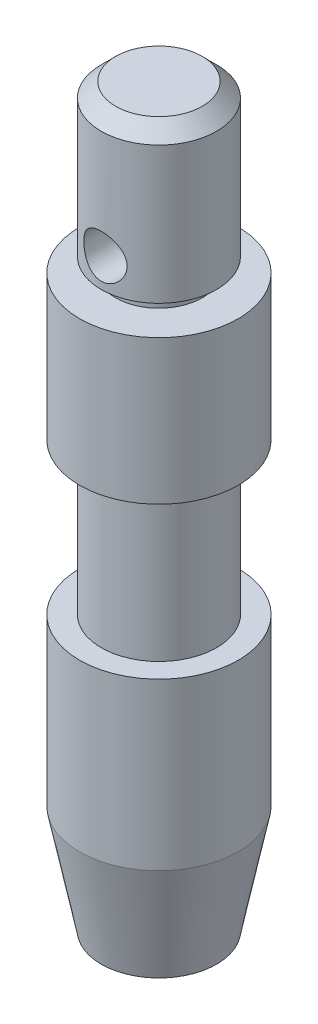
ISO-10303-21;
HEADER;
FILE_DESCRIPTION(('STEP AP214'),'2;1');
FILE_NAME('part.step','',(''),(''),'','','');
FILE_SCHEMA(('AUTOMOTIVE_DESIGN { 1 0 10303 214 1 1 1 1 }'));
ENDSEC;
DATA;
#1=APPLICATION_CONTEXT('core data for automotive mechanical design processes');
#2=APPLICATION_PROTOCOL_DEFINITION('international standard','automotive_design',2000,#1);
#3=PRODUCT_CONTEXT('',#1,'mechanical');
#4=PRODUCT('Part','Part','',(#3));
#5=PRODUCT_RELATED_PRODUCT_CATEGORY('part','',(#4));
#6=PRODUCT_DEFINITION_FORMATION('','',#4);
#7=PRODUCT_DEFINITION_CONTEXT('part definition',#1,'design');
#8=PRODUCT_DEFINITION('design','',#6,#7);
#9=PRODUCT_DEFINITION_SHAPE('','',#8);
#10=(LENGTH_UNIT() NAMED_UNIT(*) SI_UNIT(.MILLI.,.METRE.));
#11=(NAMED_UNIT(*) PLANE_ANGLE_UNIT() SI_UNIT($,.RADIAN.));
#12=(NAMED_UNIT(*) SI_UNIT($,.STERADIAN.) SOLID_ANGLE_UNIT());
#13=UNCERTAINTY_MEASURE_WITH_UNIT(LENGTH_MEASURE(1.E-05),#10,'distance_accuracy_value','');
#14=(GEOMETRIC_REPRESENTATION_CONTEXT(3) GLOBAL_UNCERTAINTY_ASSIGNED_CONTEXT((#13)) GLOBAL_UNIT_ASSIGNED_CONTEXT((#10,
#11,#12)) REPRESENTATION_CONTEXT('',''));
#15=CARTESIAN_POINT('',(0.,0.,0.));
#16=DIRECTION('',(0.,0.,1.));
#17=DIRECTION('',(1.,0.,0.));
#18=AXIS2_PLACEMENT_3D('',#15,#16,#17);
#19=CARTESIAN_POINT('',(0.,19.,0.));
#20=DIRECTION('',(0.,-1.,0.));
#21=DIRECTION('',(0.,0.,-1.));
#22=AXIS2_PLACEMENT_3D('',#19,#20,#21);
#23=CYLINDRICAL_SURFACE('',#22,5.5);
#24=CARTESIAN_POINT('',(0.,7.50000000000015,0.));
#25=DIRECTION('',(0.,1.,0.));
#26=DIRECTION('',(0.,0.,1.));
#27=AXIS2_PLACEMENT_3D('',#24,#25,#26);
#28=CIRCLE('',#27,5.5);
#29=CARTESIAN_POINT('',(0.,7.50000000000015,5.5));
#30=VERTEX_POINT('',#29);
#31=EDGE_CURVE('E133',#30,#30,#28,.T.);
#32=ORIENTED_EDGE('',*,*,#31,.T.);
#33=EDGE_LOOP('',(#32));
#34=FACE_BOUND('',#33,.T.);
#35=CARTESIAN_POINT('',(0.,19.,0.));
#36=DIRECTION('',(0.,1.,0.));
#37=DIRECTION('',(0.,0.,1.));
#38=AXIS2_PLACEMENT_3D('',#35,#36,#37);
#39=CIRCLE('',#38,5.5);
#40=CARTESIAN_POINT('',(0.,19.,5.5));
#41=VERTEX_POINT('',#40);
#42=EDGE_CURVE('E135',#41,#41,#39,.T.);
#43=ORIENTED_EDGE('',*,*,#42,.F.);
#44=EDGE_LOOP('',(#43));
#45=FACE_BOUND('',#44,.T.);
#46=ADVANCED_FACE('F47',(#34,#45),#23,.T.);
#47=CARTESIAN_POINT('',(0.,19.,0.));
#48=DIRECTION('',(0.,1.,0.));
#49=DIRECTION('',(0.,0.,1.));
#50=AXIS2_PLACEMENT_3D('',#47,#48,#49);
#51=PLANE('',#50);
#52=CARTESIAN_POINT('',(0.,19.,0.));
#53=DIRECTION('',(0.,1.,0.));
#54=DIRECTION('',(0.,0.,1.));
#55=AXIS2_PLACEMENT_3D('',#52,#53,#54);
#56=CIRCLE('',#55,4.);
#57=CARTESIAN_POINT('',(0.,19.,-4.));
#58=VERTEX_POINT('',#57);
#59=EDGE_CURVE('E139',#58,#58,#56,.T.);
#60=ORIENTED_EDGE('',*,*,#59,.F.);
#61=EDGE_LOOP('',(#60));
#62=FACE_BOUND('',#61,.T.);
#63=ORIENTED_EDGE('',*,*,#42,.T.);
#64=EDGE_LOOP('',(#63));
#65=FACE_BOUND('',#64,.T.);
#66=ADVANCED_FACE('F101',(#62,#65),#51,.T.);
#67=CARTESIAN_POINT('',(0.,0.,0.));
#68=DIRECTION('',(0.,1.,0.));
#69=DIRECTION('',(0.,0.,1.));
#70=AXIS2_PLACEMENT_3D('',#67,#68,#69);
#71=PLANE('',#70);
#72=CARTESIAN_POINT('',(0.,0.,0.));
#73=DIRECTION('',(0.,1.,0.));
#74=DIRECTION('',(0.,0.,1.));
#75=AXIS2_PLACEMENT_3D('',#72,#73,#74);
#76=CIRCLE('',#75,3.99999999999999);
#77=CARTESIAN_POINT('',(0.,0.,3.99999999999999));
#78=VERTEX_POINT('',#77);
#79=EDGE_CURVE('E131',#78,#78,#76,.F.);
#80=ORIENTED_EDGE('',*,*,#79,.T.);
#81=EDGE_LOOP('',(#80));
#82=FACE_BOUND('',#81,.T.);
#83=ADVANCED_FACE('F108',(#82),#71,.F.);
#84=CARTESIAN_POINT('',(0.,7.50000000000015,0.));
#85=DIRECTION('',(0.,1.,0.));
#86=DIRECTION('',(0.,0.,1.));
#87=AXIS2_PLACEMENT_3D('',#84,#85,#86);
#88=CONICAL_SURFACE('',#87,5.5,0.197395559849877);
#89=CARTESIAN_POINT('',(0.,0.,3.99999999999999));
#90=CARTESIAN_POINT('',(0.,0.0781250000000007,4.01562499999999));
#91=CARTESIAN_POINT('',(0.,0.156250000000002,4.03124999999999));
#92=CARTESIAN_POINT('',(0.,0.312500000000005,4.06249999999999));
#93=CARTESIAN_POINT('',(0.,0.390625000000007,4.07812499999999));
#94=CARTESIAN_POINT('',(0.,0.546875000000011,4.10937499999999));
#95=CARTESIAN_POINT('',(0.,0.625000000000012,4.12499999999999));
#96=CARTESIAN_POINT('',(0.,0.781250000000015,4.15624999999999));
#97=CARTESIAN_POINT('',(0.,0.859375000000017,4.17187499999999));
#98=CARTESIAN_POINT('',(0.,1.01562500000002,4.20312499999999));
#99=CARTESIAN_POINT('',(0.,1.09375000000002,4.21874999999999));
#100=CARTESIAN_POINT('',(0.,1.25000000000002,4.24999999999999));
#101=CARTESIAN_POINT('',(0.,1.32812500000003,4.26562499999999));
#102=CARTESIAN_POINT('',(0.,1.48437500000003,4.296875));
#103=CARTESIAN_POINT('',(0.,1.56250000000003,4.3125));
#104=CARTESIAN_POINT('',(0.,1.71875000000003,4.34375));
#105=CARTESIAN_POINT('',(0.,1.79687500000004,4.359375));
#106=CARTESIAN_POINT('',(0.,1.95312500000004,4.390625));
#107=CARTESIAN_POINT('',(0.,2.03125000000004,4.40625));
#108=CARTESIAN_POINT('',(0.,2.18750000000004,4.4375));
#109=CARTESIAN_POINT('',(0.,2.26562500000005,4.453125));
#110=CARTESIAN_POINT('',(0.,2.42187500000005,4.484375));
#111=CARTESIAN_POINT('',(0.,2.50000000000005,4.5));
#112=CARTESIAN_POINT('',(0.,2.65625000000005,4.53125));
#113=CARTESIAN_POINT('',(0.,2.73437500000006,4.546875));
#114=CARTESIAN_POINT('',(0.,2.89062500000006,4.578125));
#115=CARTESIAN_POINT('',(0.,2.96875000000006,4.59375));
#116=CARTESIAN_POINT('',(0.,3.12500000000006,4.625));
#117=CARTESIAN_POINT('',(0.,3.20312500000006,4.640625));
#118=CARTESIAN_POINT('',(0.,3.35937500000007,4.671875));
#119=CARTESIAN_POINT('',(0.,3.43750000000007,4.6875));
#120=CARTESIAN_POINT('',(0.,3.59375000000007,4.71875));
#121=CARTESIAN_POINT('',(0.,3.67187500000007,4.734375));
#122=CARTESIAN_POINT('',(0.,3.82812500000008,4.765625));
#123=CARTESIAN_POINT('',(0.,3.90625000000008,4.78125));
#124=CARTESIAN_POINT('',(0.,4.06250000000008,4.8125));
#125=CARTESIAN_POINT('',(0.,4.14062500000008,4.828125));
#126=CARTESIAN_POINT('',(0.,4.29687500000009,4.859375));
#127=CARTESIAN_POINT('',(0.,4.37500000000009,4.875));
#128=CARTESIAN_POINT('',(0.,4.53125000000009,4.90625));
#129=CARTESIAN_POINT('',(0.,4.60937500000009,4.921875));
#130=CARTESIAN_POINT('',(0.,4.7656250000001,4.953125));
#131=CARTESIAN_POINT('',(0.,4.8437500000001,4.96875));
#132=CARTESIAN_POINT('',(0.,5.0000000000001,5.));
#133=CARTESIAN_POINT('',(0.,5.0781250000001,5.015625));
#134=CARTESIAN_POINT('',(0.,5.23437500000011,5.046875));
#135=CARTESIAN_POINT('',(0.,5.31250000000011,5.0625));
#136=CARTESIAN_POINT('',(0.,5.46875000000011,5.09375));
#137=CARTESIAN_POINT('',(0.,5.54687500000011,5.109375));
#138=CARTESIAN_POINT('',(0.,5.70312500000012,5.140625));
#139=CARTESIAN_POINT('',(0.,5.78125000000012,5.15625));
#140=CARTESIAN_POINT('',(0.,5.93750000000012,5.1875));
#141=CARTESIAN_POINT('',(0.,6.01562500000012,5.203125));
#142=CARTESIAN_POINT('',(0.,6.17187500000012,5.234375));
#143=CARTESIAN_POINT('',(0.,6.25000000000013,5.25));
#144=CARTESIAN_POINT('',(0.,6.40625000000013,5.28125));
#145=CARTESIAN_POINT('',(0.,6.48437500000013,5.296875));
#146=CARTESIAN_POINT('',(0.,6.64062500000013,5.328125));
#147=CARTESIAN_POINT('',(0.,6.71875000000014,5.34375));
#148=CARTESIAN_POINT('',(0.,6.87500000000014,5.375));
#149=CARTESIAN_POINT('',(0.,6.95312500000014,5.390625));
#150=CARTESIAN_POINT('',(0.,7.10937500000014,5.421875));
#151=CARTESIAN_POINT('',(0.,7.18750000000014,5.4375));
#152=CARTESIAN_POINT('',(0.,7.34375000000015,5.46875));
#153=CARTESIAN_POINT('',(0.,7.42187500000015,5.484375));
#154=CARTESIAN_POINT('',(0.,7.50000000000015,5.5));
#155=B_SPLINE_CURVE_WITH_KNOTS('',3,(#89,#90,#91,#92,#93,#94,#95,#96,#97,#98,#99,#100,#101,#102,
#103,#104,#105,#106,#107,#108,#109,#110,#111,#112,#113,#114,#115,#116,#117,#118,#119,#120,#121,
#122,#123,#124,#125,#126,#127,#128,#129,#130,#131,#132,#133,#134,#135,#136,#137,#138,#139,#140,
#141,#142,#143,#144,#145,#146,#147,#148,#149,#150,#151,#152,#153,#154),.UNSPECIFIED.,.F.,.F.,(4,
2,2,2,2,2,2,2,2,2,2,2,2,2,2,2,2,2,2,2,2,2,2,2,2,2,2,2,2,2,2,2,4),(0.,0.239016539699666,
0.478033079399333,0.717049619099,0.956066158798666,1.19508269849833,1.434099238198,
1.67311577789767,1.91213231759733,2.151148857297,2.39016539699667,2.62918193669633,
2.868198476396,3.10721501609566,3.34623155579533,3.585248095495,3.82426463519466,
4.06328117489433,4.302297714594,4.54131425429366,4.78033079399333,5.019347333693,
5.25836387339266,5.49738041309233,5.73639695279199,5.97541349249166,6.21443003219133,
6.45344657189099,6.69246311159066,6.93147965129033,7.17049619098999,7.40951273068966,
7.64852927038933),.UNSPECIFIED.);
#156=EDGE_CURVE('BSEAM115',#78,#30,#155,.T.);
#157=ORIENTED_EDGE('',*,*,#79,.F.);
#158=ORIENTED_EDGE('',*,*,#31,.F.);
#159=ORIENTED_EDGE('',*,*,#156,.T.);
#160=ORIENTED_EDGE('',*,*,#156,.F.);
#161=EDGE_LOOP('',(#157,#159,#158,#160));
#162=FACE_BOUND('',#161,.T.);
#163=ADVANCED_FACE('F115',(#162),#88,.T.);
#164=CARTESIAN_POINT('',(0.,29.5,0.));
#165=DIRECTION('',(0.,-1.,0.));
#166=DIRECTION('',(0.,0.,-1.));
#167=AXIS2_PLACEMENT_3D('',#164,#165,#166);
#168=CYLINDRICAL_SURFACE('',#167,4.);
#169=CARTESIAN_POINT('',(0.,29.5,0.));
#170=DIRECTION('',(0.,1.,0.));
#171=DIRECTION('',(0.,0.,1.));
#172=AXIS2_PLACEMENT_3D('',#169,#170,#171);
#173=CIRCLE('',#172,4.);
#174=CARTESIAN_POINT('',(0.,29.5,-4.));
#175=VERTEX_POINT('',#174);
#176=EDGE_CURVE('E141',#175,#175,#173,.T.);
#177=CARTESIAN_POINT('',(0.,29.5,-4.));
#178=CARTESIAN_POINT('',(0.,29.390625,-4.));
#179=CARTESIAN_POINT('',(0.,29.28125,-4.));
#180=CARTESIAN_POINT('',(0.,29.0625,-4.));
#181=CARTESIAN_POINT('',(0.,28.953125,-4.));
#182=CARTESIAN_POINT('',(0.,28.734375,-4.));
#183=CARTESIAN_POINT('',(0.,28.625,-4.));
#184=CARTESIAN_POINT('',(0.,28.40625,-4.));
#185=CARTESIAN_POINT('',(0.,28.296875,-4.));
#186=CARTESIAN_POINT('',(0.,28.078125,-4.));
#187=CARTESIAN_POINT('',(0.,27.96875,-4.));
#188=CARTESIAN_POINT('',(0.,27.75,-4.));
#189=CARTESIAN_POINT('',(0.,27.640625,-4.));
#190=CARTESIAN_POINT('',(0.,27.421875,-4.));
#191=CARTESIAN_POINT('',(0.,27.3125,-4.));
#192=CARTESIAN_POINT('',(0.,27.09375,-4.));
#193=CARTESIAN_POINT('',(0.,26.984375,-4.));
#194=CARTESIAN_POINT('',(0.,26.765625,-4.));
#195=CARTESIAN_POINT('',(0.,26.65625,-4.));
#196=CARTESIAN_POINT('',(0.,26.4375,-4.));
#197=CARTESIAN_POINT('',(0.,26.328125,-4.));
#198=CARTESIAN_POINT('',(0.,26.109375,-4.));
#199=CARTESIAN_POINT('',(0.,26.,-4.));
#200=CARTESIAN_POINT('',(0.,25.78125,-4.));
#201=CARTESIAN_POINT('',(0.,25.671875,-4.));
#202=CARTESIAN_POINT('',(0.,25.453125,-4.));
#203=CARTESIAN_POINT('',(0.,25.34375,-4.));
#204=CARTESIAN_POINT('',(0.,25.125,-4.));
#205=CARTESIAN_POINT('',(0.,25.015625,-4.));
#206=CARTESIAN_POINT('',(0.,24.796875,-4.));
#207=CARTESIAN_POINT('',(0.,24.6875,-4.));
#208=CARTESIAN_POINT('',(0.,24.46875,-4.));
#209=CARTESIAN_POINT('',(0.,24.359375,-4.));
#210=CARTESIAN_POINT('',(0.,24.140625,-4.));
#211=CARTESIAN_POINT('',(0.,24.03125,-4.));
#212=CARTESIAN_POINT('',(0.,23.8125,-4.));
#213=CARTESIAN_POINT('',(0.,23.703125,-4.));
#214=CARTESIAN_POINT('',(0.,23.484375,-4.));
#215=CARTESIAN_POINT('',(0.,23.375,-4.));
#216=CARTESIAN_POINT('',(0.,23.15625,-4.));
#217=CARTESIAN_POINT('',(0.,23.046875,-4.));
#218=CARTESIAN_POINT('',(0.,22.828125,-4.));
#219=CARTESIAN_POINT('',(0.,22.71875,-4.));
#220=CARTESIAN_POINT('',(0.,22.5,-4.));
#221=CARTESIAN_POINT('',(0.,22.390625,-4.));
#222=CARTESIAN_POINT('',(0.,22.171875,-4.));
#223=CARTESIAN_POINT('',(0.,22.0625,-4.));
#224=CARTESIAN_POINT('',(0.,21.84375,-4.));
#225=CARTESIAN_POINT('',(0.,21.734375,-4.));
#226=CARTESIAN_POINT('',(0.,21.515625,-4.));
#227=CARTESIAN_POINT('',(0.,21.40625,-4.));
#228=CARTESIAN_POINT('',(0.,21.1875,-4.));
#229=CARTESIAN_POINT('',(0.,21.078125,-4.));
#230=CARTESIAN_POINT('',(0.,20.859375,-4.));
#231=CARTESIAN_POINT('',(0.,20.75,-4.));
#232=CARTESIAN_POINT('',(0.,20.53125,-4.));
#233=CARTESIAN_POINT('',(0.,20.421875,-4.));
#234=CARTESIAN_POINT('',(0.,20.203125,-4.));
#235=CARTESIAN_POINT('',(0.,20.09375,-4.));
#236=CARTESIAN_POINT('',(0.,19.875,-4.));
#237=CARTESIAN_POINT('',(0.,19.765625,-4.));
#238=CARTESIAN_POINT('',(0.,19.546875,-4.));
#239=CARTESIAN_POINT('',(0.,19.4375,-4.));
#240=CARTESIAN_POINT('',(0.,19.21875,-4.));
#241=CARTESIAN_POINT('',(0.,19.109375,-4.));
#242=CARTESIAN_POINT('',(0.,19.,-4.));
#243=B_SPLINE_CURVE_WITH_KNOTS('',3,(#177,#178,#179,#180,#181,#182,#183,#184,#185,#186,#187,
#188,#189,#190,#191,#192,#193,#194,#195,#196,#197,#198,#199,#200,#201,#202,#203,#204,#205,#206,
#207,#208,#209,#210,#211,#212,#213,#214,#215,#216,#217,#218,#219,#220,#221,#222,#223,#224,#225,
#226,#227,#228,#229,#230,#231,#232,#233,#234,#235,#236,#237,#238,#239,#240,#241,#242),
.UNSPECIFIED.,.F.,.F.,(4,2,2,2,2,2,2,2,2,2,2,2,2,2,2,2,2,2,2,2,2,2,2,2,2,2,2,2,2,2,2,2,4),(0.,
0.328124999999999,0.656249999999997,0.984374999999999,1.3125,1.640625,1.96875,2.296875,2.625,
2.953125,3.28125,3.609375,3.9375,4.265625,4.59375,4.921875,5.25,5.578125,5.90625,6.234375,
6.5625,6.890625,7.21875,7.546875,7.875,8.20312499999999,8.53125,8.859375,9.1875,9.515625,
9.84374999999999,10.171875,10.5),.UNSPECIFIED.);
#244=EDGE_CURVE('BSEAM119',#175,#58,#243,.T.);
#245=ORIENTED_EDGE('',*,*,#176,.F.);
#246=ORIENTED_EDGE('',*,*,#59,.T.);
#247=ORIENTED_EDGE('',*,*,#244,.T.);
#248=ORIENTED_EDGE('',*,*,#244,.F.);
#249=EDGE_LOOP('',(#245,#247,#246,#248));
#250=FACE_BOUND('',#249,.T.);
#251=ADVANCED_FACE('F119',(#250),#168,.T.);
#252=CARTESIAN_POINT('',(0.,39.5,0.));
#253=DIRECTION('',(0.,-1.,0.));
#254=DIRECTION('',(0.,0.,-1.));
#255=AXIS2_PLACEMENT_3D('',#252,#253,#254);
#256=CYLINDRICAL_SURFACE('',#255,5.5);
#257=CARTESIAN_POINT('',(0.,39.5,0.));
#258=DIRECTION('',(0.,1.,0.));
#259=DIRECTION('',(0.,0.,1.));
#260=AXIS2_PLACEMENT_3D('',#257,#258,#259);
#261=CIRCLE('',#260,5.5);
#262=CARTESIAN_POINT('',(0.,39.5,5.5));
#263=VERTEX_POINT('',#262);
#264=EDGE_CURVE('E150',#263,#263,#261,.T.);
#265=ORIENTED_EDGE('',*,*,#264,.F.);
#266=EDGE_LOOP('',(#265));
#267=FACE_BOUND('',#266,.T.);
#268=CARTESIAN_POINT('',(0.,29.5,0.));
#269=DIRECTION('',(0.,1.,0.));
#270=DIRECTION('',(0.,0.,1.));
#271=AXIS2_PLACEMENT_3D('',#268,#269,#270);
#272=CIRCLE('',#271,5.5);
#273=CARTESIAN_POINT('',(0.,29.5,5.5));
#274=VERTEX_POINT('',#273);
#275=EDGE_CURVE('E151',#274,#274,#272,.T.);
#276=ORIENTED_EDGE('',*,*,#275,.T.);
#277=EDGE_LOOP('',(#276));
#278=FACE_BOUND('',#277,.T.);
#279=ADVANCED_FACE('F124',(#267,#278),#256,.T.);
#280=CARTESIAN_POINT('',(0.,39.5,0.));
#281=DIRECTION('',(0.,1.,0.));
#282=DIRECTION('',(0.,0.,1.));
#283=AXIS2_PLACEMENT_3D('',#280,#281,#282);
#284=PLANE('',#283);
#285=CARTESIAN_POINT('',(0.,39.5,0.));
#286=DIRECTION('',(0.,1.,0.));
#287=DIRECTION('',(0.,0.,1.));
#288=AXIS2_PLACEMENT_3D('',#285,#286,#287);
#289=CIRCLE('',#288,3.);
#290=CARTESIAN_POINT('',(0.,39.5,3.));
#291=VERTEX_POINT('',#290);
#292=EDGE_CURVE('E68',#291,#291,#289,.T.);
#293=ORIENTED_EDGE('',*,*,#292,.F.);
#294=EDGE_LOOP('',(#293));
#295=FACE_BOUND('',#294,.T.);
#296=ORIENTED_EDGE('',*,*,#264,.T.);
#297=EDGE_LOOP('',(#296));
#298=FACE_BOUND('',#297,.T.);
#299=ADVANCED_FACE('F186',(#295,#298),#284,.T.);
#300=CARTESIAN_POINT('',(0.,29.5,0.));
#301=DIRECTION('',(0.,1.,0.));
#302=DIRECTION('',(0.,0.,1.));
#303=AXIS2_PLACEMENT_3D('',#300,#301,#302);
#304=PLANE('',#303);
#305=ORIENTED_EDGE('',*,*,#176,.T.);
#306=EDGE_LOOP('',(#305));
#307=FACE_BOUND('',#306,.T.);
#308=ORIENTED_EDGE('',*,*,#275,.F.);
#309=EDGE_LOOP('',(#308));
#310=FACE_BOUND('',#309,.T.);
#311=ADVANCED_FACE('F180',(#307,#310),#304,.F.);
#312=CARTESIAN_POINT('',(0.,40.5,0.));
#313=DIRECTION('',(0.,-1.,0.));
#314=DIRECTION('',(0.,0.,-1.));
#315=AXIS2_PLACEMENT_3D('',#312,#313,#314);
#316=CYLINDRICAL_SURFACE('',#315,3.);
#317=CARTESIAN_POINT('',(0.,40.5,0.));
#318=DIRECTION('',(0.,1.,0.));
#319=DIRECTION('',(0.,0.,1.));
#320=AXIS2_PLACEMENT_3D('',#317,#318,#319);
#321=CIRCLE('',#320,3.);
#322=CARTESIAN_POINT('',(0.,40.5,3.));
#323=VERTEX_POINT('',#322);
#324=EDGE_CURVE('E155',#323,#323,#321,.T.);
#325=ORIENTED_EDGE('',*,*,#324,.F.);
#326=EDGE_LOOP('',(#325));
#327=FACE_BOUND('',#326,.T.);
#328=ORIENTED_EDGE('',*,*,#292,.T.);
#329=EDGE_LOOP('',(#328));
#330=FACE_BOUND('',#329,.T.);
#331=ADVANCED_FACE('F176',(#327,#330),#316,.T.);
#332=CARTESIAN_POINT('',(0.,51.,0.));
#333=DIRECTION('',(0.,-1.,0.));
#334=DIRECTION('',(0.,0.,-1.));
#335=AXIS2_PLACEMENT_3D('',#332,#333,#334);
#336=CYLINDRICAL_SURFACE('',#335,4.);
#337=CARTESIAN_POINT('',(0.,44.,-4.));
#338=CARTESIAN_POINT('',(-0.0812350589378532,44.0000029023031,-4.00000217456151));
#339=CARTESIAN_POINT('',(-0.162450241781793,43.9933802397516,-3.99750379283184));
#340=CARTESIAN_POINT('',(-0.322453452352362,43.9671718047301,-3.98778696006928));
#341=CARTESIAN_POINT('',(-0.401241827987616,43.9475878995294,-3.98056918893993));
#342=CARTESIAN_POINT('',(-0.554060784990881,43.8962469982282,-3.96218832391545));
#343=CARTESIAN_POINT('',(-0.628100224162283,43.8645134831782,-3.9510328434944));
#344=CARTESIAN_POINT('',(-0.769799310160259,43.7898935869842,-3.92588767765353));
#345=CARTESIAN_POINT('',(-0.837457239177882,43.7470042144558,-3.91189723227548));
#346=CARTESIAN_POINT('',(-0.967346417045828,43.6493874689291,-3.88186246971217));
#347=CARTESIAN_POINT('',(-1.0292707301512,43.5942697377406,-3.86576002583566));
#348=CARTESIAN_POINT('',(-1.14324421474363,43.4745895653412,-3.83360220871327));
#349=CARTESIAN_POINT('',(-1.19529036359203,43.4100242439121,-3.81754685135033));
#350=CARTESIAN_POINT('',(-1.28998202215985,43.2702825324768,-3.78662470617731));
#351=CARTESIAN_POINT('',(-1.3321939319576,43.1947956334542,-3.77182648820818));
#352=CARTESIAN_POINT('',(-1.40318646334084,43.0371516458315,-3.74599860237433));
#353=CARTESIAN_POINT('',(-1.43197244961239,42.9549972368449,-3.73496742975881));
#354=CARTESIAN_POINT('',(-1.47408431017549,42.7898832597418,-3.71854412824136));
#355=CARTESIAN_POINT('',(-1.48799593218558,42.7070949615646,-3.71293924350838));
#356=CARTESIAN_POINT('',(-1.50179556531648,42.5401838420062,-3.70738061461215));
#357=CARTESIAN_POINT('',(-1.50168936802631,42.4560615861255,-3.70742453659305));
#358=CARTESIAN_POINT('',(-1.48790429610018,42.294230474787,-3.71297511632055));
#359=CARTESIAN_POINT('',(-1.47503808509004,42.2164390939558,-3.71815468871122));
#360=CARTESIAN_POINT('',(-1.4374416786833,42.0642128495947,-3.73284938059529));
#361=CARTESIAN_POINT('',(-1.41270969663258,41.9897784933861,-3.74236515298863));
#362=CARTESIAN_POINT('',(-1.35163748571904,41.8447229322718,-3.76485702190253));
#363=CARTESIAN_POINT('',(-1.31508648737101,41.7742005138787,-3.77789517988166));
#364=CARTESIAN_POINT('',(-1.23156073762698,41.640054262409,-3.80594210139319));
#365=CARTESIAN_POINT('',(-1.18458238728897,41.5764328224803,-3.82095154457158));
#366=CARTESIAN_POINT('',(-1.07781780766549,41.4533963363491,-3.85248038859113));
#367=CARTESIAN_POINT('',(-1.01738298716955,41.3945513592519,-3.86903347455671));
#368=CARTESIAN_POINT('',(-0.887312590819017,41.2876620337942,-3.90091728164086));
#369=CARTESIAN_POINT('',(-0.81767560349736,41.2396193453943,-3.91624781465952));
#370=CARTESIAN_POINT('',(-0.669723436992415,41.1550696029375,-3.9442639480908));
#371=CARTESIAN_POINT('',(-0.591290713844715,41.1187524187789,-3.95690498259616));
#372=CARTESIAN_POINT('',(-0.42883685052458,41.06001739573,-3.97778718326962));
#373=CARTESIAN_POINT('',(-0.344818210845765,41.0375933834389,-3.98603030341493));
#374=CARTESIAN_POINT('',(-0.178375243148663,41.0083772124581,-3.99684443228065));
#375=CARTESIAN_POINT('',(-0.0961036195622073,41.0008173936175,-3.99969369025686));
#376=CARTESIAN_POINT('',(0.068572475255026,40.9993089361001,-4.00025893700126));
#377=CARTESIAN_POINT('',(0.150976912983374,41.0053572796832,-3.99797606386863));
#378=CARTESIAN_POINT('',(0.31026204856186,41.0303100423087,-3.98871709772643));
#379=CARTESIAN_POINT('',(0.387233328007337,41.0487115437371,-3.98192470962305));
#380=CARTESIAN_POINT('',(0.536941754957222,41.0971860725473,-3.96451477091717));
#381=CARTESIAN_POINT('',(0.609678350347535,41.127260617948,-3.9538967228203));
#382=CARTESIAN_POINT('',(0.751247765110158,41.1991864124395,-3.92949624407681));
#383=CARTESIAN_POINT('',(0.819903083557799,41.2413577292234,-3.91563000209348));
#384=CARTESIAN_POINT('',(0.94939271172663,41.3359181031716,-3.88626671564664));
#385=CARTESIAN_POINT('',(1.01022412027045,41.3883109325452,-3.87076907009516));
#386=CARTESIAN_POINT('',(1.12603079874455,41.5054041221243,-3.83873329490989));
#387=CARTESIAN_POINT('',(1.18046154123569,41.5706421827727,-3.82218696503729));
#388=CARTESIAN_POINT('',(1.27771050031904,41.7096513847077,-3.79078815746854));
#389=CARTESIAN_POINT('',(1.32052767414519,41.7834232913885,-3.77593583194399));
#390=CARTESIAN_POINT('',(1.39337773518998,41.9380159867723,-3.74966829822463));
#391=CARTESIAN_POINT('',(1.42335685446918,42.0188647459104,-3.73826760328493));
#392=CARTESIAN_POINT('',(1.46907883466889,42.1850097636878,-3.72054032891005));
#393=CARTESIAN_POINT('',(1.48483050305535,42.2703032361981,-3.71421061057491));
#394=CARTESIAN_POINT('',(1.50086347097839,42.4370161595411,-3.70775894792573));
#395=CARTESIAN_POINT('',(1.50207331495837,42.5183326317169,-3.70726444523341));
#396=CARTESIAN_POINT('',(1.49136715641593,42.6799453162762,-3.71158412745292));
#397=CARTESIAN_POINT('',(1.47945239850123,42.7602416246716,-3.71639780898899));
#398=CARTESIAN_POINT('',(1.44355815630242,42.9150472267166,-3.73048141585432));
#399=CARTESIAN_POINT('',(1.41995798316524,42.9896583462453,-3.73961085376663));
#400=CARTESIAN_POINT('',(1.3616969677992,43.1339055084944,-3.76121548297845));
#401=CARTESIAN_POINT('',(1.32703332944944,43.2035402880702,-3.77369151995215));
#402=CARTESIAN_POINT('',(1.24552075938153,43.3398267896976,-3.80139723903965));
#403=CARTESIAN_POINT('',(1.1981283280301,43.4061307967999,-3.81673698440964));
#404=CARTESIAN_POINT('',(1.09334485729906,43.5301415609712,-3.84806246757177));
#405=CARTESIAN_POINT('',(1.03595064012808,43.5878455747868,-3.86404840943145));
#406=CARTESIAN_POINT('',(0.909080396784618,43.6962019558218,-3.89590424609881));
#407=CARTESIAN_POINT('',(0.839118644212988,43.7463037534347,-3.91172104900645));
#408=CARTESIAN_POINT('',(0.691213223200817,43.8340226552766,-3.94054514457031));
#409=CARTESIAN_POINT('',(0.613268934090618,43.8716387877364,-3.95355221851559));
#410=CARTESIAN_POINT('',(0.447999082002309,43.9343768290483,-3.9757429260668));
#411=CARTESIAN_POINT('',(0.360413422234206,43.9588870646019,-3.98473657158356));
#412=CARTESIAN_POINT('',(0.181875733606381,43.9916929599207,-3.99686242179587));
#413=CARTESIAN_POINT('',(0.0909254163648584,43.9999967514873,-3.99999756603967));
#414=CARTESIAN_POINT('',(0.,44.,-4.));
#415=B_SPLINE_CURVE_WITH_KNOTS('',3,(#337,#338,#339,#340,#341,#342,#343,#344,#345,#346,#347,
#348,#349,#350,#351,#352,#353,#354,#355,#356,#357,#358,#359,#360,#361,#362,#363,#364,#365,#366,
#367,#368,#369,#370,#371,#372,#373,#374,#375,#376,#377,#378,#379,#380,#381,#382,#383,#384,#385,
#386,#387,#388,#389,#390,#391,#392,#393,#394,#395,#396,#397,#398,#399,#400,#401,#402,#403,#404,
#405,#406,#407,#408,#409,#410,#411,#412,#413,#414),.UNSPECIFIED.,.T.,.F.,(4,2,2,2,2,2,2,2,2,2,2,
2,2,2,2,2,2,2,2,2,2,2,2,2,2,2,2,2,2,2,2,2,2,2,2,2,2,2,4),(0.,0.24336980156056,0.486704549530462,
0.729571369213581,0.972503379609492,1.22473618582716,1.47704604925622,1.73896674501658,
2.00078269352134,2.25185874416901,2.50283106079708,2.73878345119971,2.97477138060589,
3.21522408387018,3.45575990744259,3.71246153335813,3.96920257905067,4.22991375286076,
4.49050899698846,4.73725019635926,4.98393668390521,5.2211443792384,5.45838293254454,
5.702592218596,5.94689180019868,6.20536519455659,6.46386178920141,6.72343066727204,
6.98283874956507,7.22558763480252,7.46831350211259,7.70363142426533,7.93900886656507,
8.18672471884272,8.43451941997063,8.6957232965404,8.95694749805103,9.22948515032042,
9.50188601796128),.UNSPECIFIED.);
#416=CARTESIAN_POINT('',(0.,44.,-4.));
#417=VERTEX_POINT('',#416);
#418=EDGE_CURVE('E52',#417,#417,#415,.T.);
#419=ORIENTED_EDGE('',*,*,#418,.T.);
#420=EDGE_LOOP('',(#419));
#421=FACE_BOUND('',#420,.T.);
#422=CARTESIAN_POINT('',(1.5,42.5,3.70809924354783));
#423=CARTESIAN_POINT('',(1.50000304106109,42.4189925162792,3.70809640633806));
#424=CARTESIAN_POINT('',(1.49341597549487,42.3380050774964,3.71078260240986));
#425=CARTESIAN_POINT('',(1.46736187895468,42.1784719170868,3.72116159304967));
#426=CARTESIAN_POINT('',(1.44789523373263,42.099926122405,3.72885423767112));
#427=CARTESIAN_POINT('',(1.39689657610574,41.9476246283865,3.748254802809));
#428=CARTESIAN_POINT('',(1.36539347266348,41.8738579433489,3.7599530956926));
#429=CARTESIAN_POINT('',(1.29131856742697,41.7326281031812,3.78603134206598));
#430=CARTESIAN_POINT('',(1.24874344095038,41.6651668497175,3.80041210067323));
#431=CARTESIAN_POINT('',(1.15146661374162,41.5351096883772,3.83103574665713));
#432=CARTESIAN_POINT('',(1.09630381213306,41.4728714703706,3.84733341923603));
#433=CARTESIAN_POINT('',(0.976395839778927,41.3582771853285,3.87949750628547));
#434=CARTESIAN_POINT('',(0.911648630256682,41.3059232262582,3.89536382814785));
#435=CARTESIAN_POINT('',(0.771694655177603,41.2108604877044,3.92552873936553));
#436=CARTESIAN_POINT('',(0.696206947538029,41.1685405252841,3.93975561223505));
#437=CARTESIAN_POINT('',(0.538555771965247,41.0973488274751,3.96438007973847));
#438=CARTESIAN_POINT('',(0.456394630933535,41.068472428008,3.97477900217006));
#439=CARTESIAN_POINT('',(0.291489341676832,41.0262421042254,3.9901869710344));
#440=CARTESIAN_POINT('',(0.208923197281596,41.0122723725596,3.99540915214774));
#441=CARTESIAN_POINT('',(0.0424643637947859,40.998278799055,4.0006401410794));
#442=CARTESIAN_POINT('',(-0.0414278850628329,40.9982504223813,4.00065064414902));
#443=CARTESIAN_POINT('',(-0.203743543064475,41.0117817614652,3.99559265903894));
#444=CARTESIAN_POINT('',(-0.282232178266898,41.0246692979488,3.99077541996683));
#445=CARTESIAN_POINT('',(-0.43583921798439,41.0625359152256,3.97693274932263));
#446=CARTESIAN_POINT('',(-0.510957383430298,41.087515852262,3.96790701975578));
#447=CARTESIAN_POINT('',(-0.656989017303104,41.1491704516759,3.94637769167531));
#448=CARTESIAN_POINT('',(-0.727825392287308,41.1860100052684,3.93382539470077));
#449=CARTESIAN_POINT('',(-0.862486607957558,41.2701920969294,3.90651310225279));
#450=CARTESIAN_POINT('',(-0.926309176932322,41.3175380230176,3.8917523951284));
#451=CARTESIAN_POINT('',(-1.04909048680094,41.4246272862832,3.86052529655816));
#452=CARTESIAN_POINT('',(-1.10754614526348,41.4849339156504,3.84400963763883));
#453=CARTESIAN_POINT('',(-1.21370395569342,41.6145929933216,3.81182460645722));
#454=CARTESIAN_POINT('',(-1.261403406929,41.6839477065866,3.79615544748847));
#455=CARTESIAN_POINT('',(-1.34565611808152,41.8317194674628,3.76712703500335));
#456=CARTESIAN_POINT('',(-1.38193847851831,41.9103034936861,3.75382677150277));
#457=CARTESIAN_POINT('',(-1.44056464441501,42.0730962251676,3.73172438629002));
#458=CARTESIAN_POINT('',(-1.46291620605595,42.1573017715937,3.72291976205783));
#459=CARTESIAN_POINT('',(-1.49190191709668,42.323975962316,3.71139597222848));
#460=CARTESIAN_POINT('',(-1.49933521158966,42.4062841055362,3.70836785241537));
#461=CARTESIAN_POINT('',(-1.50057885636272,42.5710093567418,3.70786539525016));
#462=CARTESIAN_POINT('',(-1.49439261093762,42.6534264323525,3.71038967003987));
#463=CARTESIAN_POINT('',(-1.46929733520157,42.8119299222877,3.72039381629735));
#464=CARTESIAN_POINT('',(-1.45100618334224,42.8881311357647,3.72763276216449));
#465=CARTESIAN_POINT('',(-1.40299774640637,43.0363479447202,3.74596487046362));
#466=CARTESIAN_POINT('',(-1.37327812034623,43.1083626791681,3.75705882250173));
#467=CARTESIAN_POINT('',(-1.30200292275278,43.2491644380762,3.7823624311608));
#468=CARTESIAN_POINT('',(-1.26004545177047,43.3177292921373,3.79667328892065));
#469=CARTESIAN_POINT('',(-1.16591317862479,43.447128981726,3.82662814294291));
#470=CARTESIAN_POINT('',(-1.11373463696435,43.5079609746246,3.84227262594077));
#471=CARTESIAN_POINT('',(-0.996727340900938,43.6241683731951,3.87433046553184));
#472=CARTESIAN_POINT('',(-0.931306341491062,43.6789534087688,3.89072969357028));
#473=CARTESIAN_POINT('',(-0.791797471753152,43.7768383675894,3.92149874963302));
#474=CARTESIAN_POINT('',(-0.717709573322674,43.8199382529458,3.93586857107664));
#475=CARTESIAN_POINT('',(-0.563016329468477,43.8929460561996,3.96094985704552));
#476=CARTESIAN_POINT('',(-0.482434433064626,43.9228991237926,3.9716738133801));
#477=CARTESIAN_POINT('',(-0.316881887523253,43.9686564138499,3.98829436712571));
#478=CARTESIAN_POINT('',(-0.231913320723591,43.9844672854224,3.99419323299412));
#479=CARTESIAN_POINT('',(-0.0653355852738135,44.0007744027548,4.00028407317073));
#480=CARTESIAN_POINT('',(0.0161807680608472,44.002109483059,4.00078860953764));
#481=CARTESIAN_POINT('',(0.178226786412425,43.9915848405546,3.99684889809223));
#482=CARTESIAN_POINT('',(0.258756569245257,43.9797267091141,3.9924052471313));
#483=CARTESIAN_POINT('',(0.414548248377127,43.9437411485064,3.97921089603771));
#484=CARTESIAN_POINT('',(0.489890731068836,43.9199200941217,3.97056791378017));
#485=CARTESIAN_POINT('',(0.635515473006391,43.8609899866156,3.9498778362099));
#486=CARTESIAN_POINT('',(0.705796771275543,43.8258787966952,3.93783009655664));
#487=CARTESIAN_POINT('',(0.842540176994411,43.7436860564952,3.91090618300074));
#488=CARTESIAN_POINT('',(0.908717548846848,43.6961633594859,3.89593240108828));
#489=CARTESIAN_POINT('',(1.03241734752336,43.5911921698124,3.86499507694844));
#490=CARTESIAN_POINT('',(1.0899366712559,43.5337401341921,3.84903118274027));
#491=CARTESIAN_POINT('',(1.19781214236195,43.4069358683549,3.81688129739175));
#492=CARTESIAN_POINT('',(1.24762999816025,43.3371155978457,3.8007280534916));
#493=CARTESIAN_POINT('',(1.33484709556844,43.1895841304267,3.77098325003638));
#494=CARTESIAN_POINT('',(1.37224504878157,43.1118721159465,3.75739195631216));
#495=CARTESIAN_POINT('',(1.43465886974261,42.9470443190246,3.73402269853266));
#496=CARTESIAN_POINT('',(1.45906002899523,42.8596656334882,3.7244380329086));
#497=CARTESIAN_POINT('',(1.49172356722079,42.6815147280442,3.71147994336315));
#498=CARTESIAN_POINT('',(1.49999659339571,42.59074478729,3.70810242179736));
#499=CARTESIAN_POINT('',(1.5,42.5,3.70809924354783));
#500=B_SPLINE_CURVE_WITH_KNOTS('',3,(#422,#423,#424,#425,#426,#427,#428,#429,#430,#431,#432,
#433,#434,#435,#436,#437,#438,#439,#440,#441,#442,#443,#444,#445,#446,#447,#448,#449,#450,#451,
#452,#453,#454,#455,#456,#457,#458,#459,#460,#461,#462,#463,#464,#465,#466,#467,#468,#469,#470,
#471,#472,#473,#474,#475,#476,#477,#478,#479,#480,#481,#482,#483,#484,#485,#486,#487,#488,#489,
#490,#491,#492,#493,#494,#495,#496,#497,#498,#499),.UNSPECIFIED.,.T.,.F.,(4,2,2,2,2,2,2,2,2,2,2,
2,2,2,2,2,2,2,2,2,2,2,2,2,2,2,2,2,2,2,2,2,2,2,2,2,2,2,4),(0.,0.242684541416164,
0.485361814598854,0.727459856757041,0.969630679682934,1.22274652401128,1.47591628822983,
1.73770072136421,1.9993942638133,2.24980018489679,2.50012465404857,2.73806472803194,
2.97602165263335,3.21744131210668,3.45893893628976,3.71456675065874,3.97025867827335,
4.23162592252967,4.49284751635475,4.73965657740486,4.98640395388885,5.22143845928199,
5.45652113429527,5.70041561005821,5.94439948466355,6.20385016993624,6.46330169650178,
6.72185508890169,6.98028685560127,7.22365720549936,7.4669982031948,7.70440274003891,
7.94185223512831,8.18928323676986,8.43680270894965,8.69738599542079,8.95799630544243,
9.23003178870928,9.50188762323053),.UNSPECIFIED.);
#501=CARTESIAN_POINT('',(1.5,42.5,3.70809924354783));
#502=VERTEX_POINT('',#501);
#503=EDGE_CURVE('E71',#502,#502,#500,.T.);
#504=ORIENTED_EDGE('',*,*,#503,.T.);
#505=EDGE_LOOP('',(#504));
#506=FACE_BOUND('',#505,.T.);
#507=CARTESIAN_POINT('',(0.,50.,0.));
#508=DIRECTION('',(0.,1.,0.));
#509=DIRECTION('',(0.,0.,1.));
#510=AXIS2_PLACEMENT_3D('',#507,#508,#509);
#511=CIRCLE('',#510,4.);
#512=CARTESIAN_POINT('',(0.,50.,4.));
#513=VERTEX_POINT('',#512);
#514=EDGE_CURVE('E10',#513,#513,#511,.F.);
#515=ORIENTED_EDGE('',*,*,#514,.T.);
#516=EDGE_LOOP('',(#515));
#517=FACE_BOUND('',#516,.T.);
#518=CARTESIAN_POINT('',(0.,40.5,0.));
#519=DIRECTION('',(0.,1.,0.));
#520=DIRECTION('',(0.,0.,1.));
#521=AXIS2_PLACEMENT_3D('',#518,#519,#520);
#522=CIRCLE('',#521,4.);
#523=CARTESIAN_POINT('',(0.,40.5,4.));
#524=VERTEX_POINT('',#523);
#525=EDGE_CURVE('E164',#524,#524,#522,.T.);
#526=ORIENTED_EDGE('',*,*,#525,.T.);
#527=EDGE_LOOP('',(#526));
#528=FACE_BOUND('',#527,.T.);
#529=ADVANCED_FACE('F77',(#421,#506,#517,#528),#336,.T.);
#530=CARTESIAN_POINT('',(0.,51.,0.));
#531=DIRECTION('',(0.,1.,0.));
#532=DIRECTION('',(0.,0.,1.));
#533=AXIS2_PLACEMENT_3D('',#530,#531,#532);
#534=PLANE('',#533);
#535=CARTESIAN_POINT('',(0.,51.,0.));
#536=DIRECTION('',(0.,1.,0.));
#537=DIRECTION('',(0.,0.,1.));
#538=AXIS2_PLACEMENT_3D('',#535,#536,#537);
#539=CIRCLE('',#538,3.00000000000001);
#540=CARTESIAN_POINT('',(0.,51.,3.00000000000001));
#541=VERTEX_POINT('',#540);
#542=EDGE_CURVE('E62',#541,#541,#539,.T.);
#543=ORIENTED_EDGE('',*,*,#542,.T.);
#544=EDGE_LOOP('',(#543));
#545=FACE_BOUND('',#544,.T.);
#546=ADVANCED_FACE('F86',(#545),#534,.T.);
#547=CARTESIAN_POINT('',(0.,40.5,0.));
#548=DIRECTION('',(0.,1.,0.));
#549=DIRECTION('',(0.,0.,1.));
#550=AXIS2_PLACEMENT_3D('',#547,#548,#549);
#551=PLANE('',#550);
#552=ORIENTED_EDGE('',*,*,#324,.T.);
#553=EDGE_LOOP('',(#552));
#554=FACE_BOUND('',#553,.T.);
#555=ORIENTED_EDGE('',*,*,#525,.F.);
#556=EDGE_LOOP('',(#555));
#557=FACE_BOUND('',#556,.T.);
#558=ADVANCED_FACE('F89',(#554,#557),#551,.F.);
#559=CARTESIAN_POINT('',(0.,51.,0.));
#560=DIRECTION('',(0.,-1.,0.));
#561=DIRECTION('',(0.,0.,-1.));
#562=AXIS2_PLACEMENT_3D('',#559,#560,#561);
#563=CONICAL_SURFACE('',#562,3.00000000000001,0.78539816339745);
#564=ORIENTED_EDGE('',*,*,#514,.F.);
#565=EDGE_LOOP('',(#564));
#566=FACE_BOUND('',#565,.T.);
#567=ORIENTED_EDGE('',*,*,#542,.F.);
#568=EDGE_LOOP('',(#567));
#569=FACE_BOUND('',#568,.T.);
#570=ADVANCED_FACE('F50',(#566,#569),#563,.T.);
#571=CARTESIAN_POINT('',(0.,42.5,-5.5));
#572=DIRECTION('',(0.,0.,1.));
#573=DIRECTION('',(1.,0.,0.));
#574=AXIS2_PLACEMENT_3D('',#571,#572,#573);
#575=CYLINDRICAL_SURFACE('',#574,1.5);
#576=ORIENTED_EDGE('',*,*,#503,.F.);
#577=EDGE_LOOP('',(#576));
#578=FACE_BOUND('',#577,.T.);
#579=ORIENTED_EDGE('',*,*,#418,.F.);
#580=EDGE_LOOP('',(#579));
#581=FACE_BOUND('',#580,.T.);
#582=ADVANCED_FACE('F81',(#578,#581),#575,.F.);
#583=CLOSED_SHELL('',(#46,#66,#83,#163,#251,#279,#299,#311,#331,#529,#546,#558,#570,#582));
#584=MANIFOLD_SOLID_BREP('B2',#583);
#585=ADVANCED_BREP_SHAPE_REPRESENTATION('',(#18,#584),#14);
#586=SHAPE_DEFINITION_REPRESENTATION(#9,#585);
ENDSEC;
END-ISO-10303-21;
